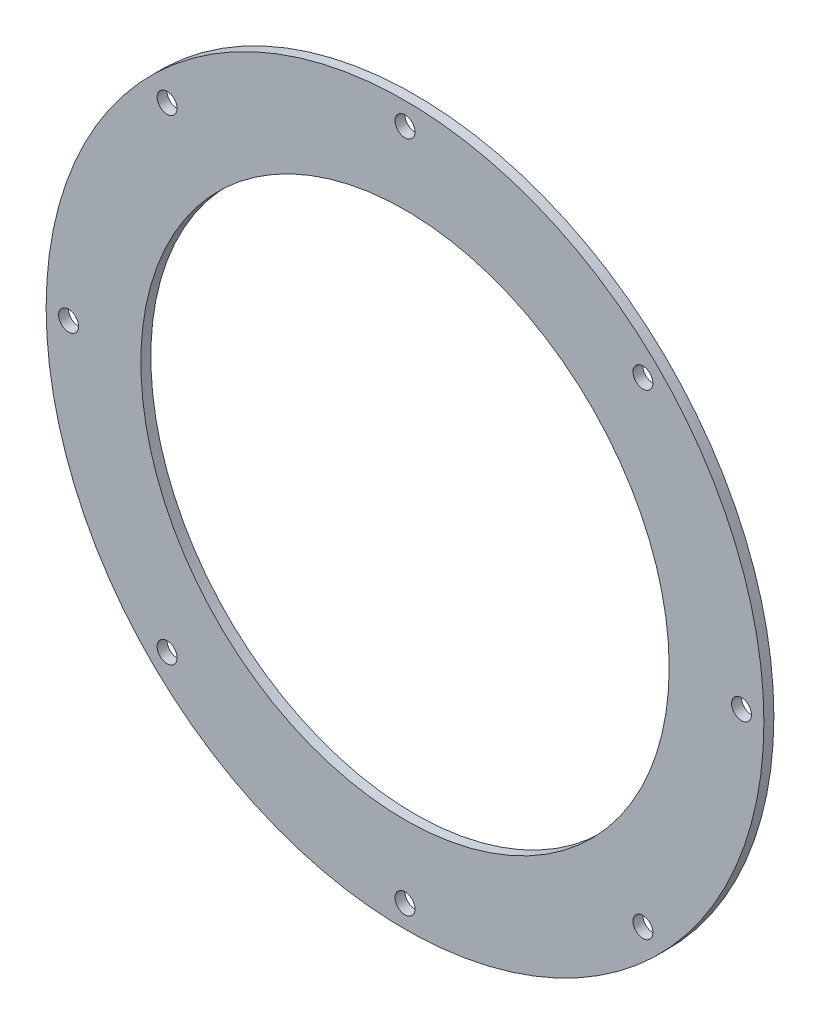
ISO-10303-21;
HEADER;
FILE_DESCRIPTION(('STEP AP214'),'2;1');
FILE_NAME('part.step','',(''),(''),'','','');
FILE_SCHEMA(('AUTOMOTIVE_DESIGN { 1 0 10303 214 1 1 1 1 }'));
ENDSEC;
DATA;
#1=APPLICATION_CONTEXT('core data for automotive mechanical design processes');
#2=APPLICATION_PROTOCOL_DEFINITION('international standard','automotive_design',2000,#1);
#3=PRODUCT_CONTEXT('',#1,'mechanical');
#4=PRODUCT('Part','Part','',(#3));
#5=PRODUCT_RELATED_PRODUCT_CATEGORY('part','',(#4));
#6=PRODUCT_DEFINITION_FORMATION('','',#4);
#7=PRODUCT_DEFINITION_CONTEXT('part definition',#1,'design');
#8=PRODUCT_DEFINITION('design','',#6,#7);
#9=PRODUCT_DEFINITION_SHAPE('','',#8);
#10=(LENGTH_UNIT() NAMED_UNIT(*) SI_UNIT(.MILLI.,.METRE.));
#11=(NAMED_UNIT(*) PLANE_ANGLE_UNIT() SI_UNIT($,.RADIAN.));
#12=(NAMED_UNIT(*) SI_UNIT($,.STERADIAN.) SOLID_ANGLE_UNIT());
#13=UNCERTAINTY_MEASURE_WITH_UNIT(LENGTH_MEASURE(1.E-05),#10,'distance_accuracy_value','');
#14=(GEOMETRIC_REPRESENTATION_CONTEXT(3) GLOBAL_UNCERTAINTY_ASSIGNED_CONTEXT((#13)) GLOBAL_UNIT_ASSIGNED_CONTEXT((#10,
#11,#12)) REPRESENTATION_CONTEXT('',''));
#15=CARTESIAN_POINT('',(0.,0.,0.));
#16=DIRECTION('',(0.,0.,1.));
#17=DIRECTION('',(1.,0.,0.));
#18=AXIS2_PLACEMENT_3D('',#15,#16,#17);
#19=CARTESIAN_POINT('',(0.,0.,2.));
#20=DIRECTION('',(0.,0.,1.));
#21=DIRECTION('',(1.,0.,0.));
#22=AXIS2_PLACEMENT_3D('',#19,#20,#21);
#23=PLANE('',#22);
#24=CARTESIAN_POINT('',(67.5,0.,2.));
#25=DIRECTION('',(0.,0.,1.));
#26=DIRECTION('',(1.,0.,0.));
#27=AXIS2_PLACEMENT_3D('',#24,#25,#26);
#28=CIRCLE('',#27,2.);
#29=CARTESIAN_POINT('',(69.5,0.,2.));
#30=VERTEX_POINT('',#29);
#31=EDGE_CURVE('E104',#30,#30,#28,.T.);
#32=ORIENTED_EDGE('',*,*,#31,.F.);
#33=EDGE_LOOP('',(#32));
#34=FACE_BOUND('',#33,.T.);
#35=CARTESIAN_POINT('',(0.,67.5,2.));
#36=DIRECTION('',(0.,0.,1.));
#37=DIRECTION('',(1.,0.,0.));
#38=AXIS2_PLACEMENT_3D('',#35,#36,#37);
#39=CIRCLE('',#38,2.);
#40=CARTESIAN_POINT('',(2.,67.5,2.));
#41=VERTEX_POINT('',#40);
#42=EDGE_CURVE('E88',#41,#41,#39,.T.);
#43=ORIENTED_EDGE('',*,*,#42,.F.);
#44=EDGE_LOOP('',(#43));
#45=FACE_BOUND('',#44,.T.);
#46=CARTESIAN_POINT('',(-67.5,0.,2.));
#47=DIRECTION('',(0.,0.,1.));
#48=DIRECTION('',(1.,0.,0.));
#49=AXIS2_PLACEMENT_3D('',#46,#47,#48);
#50=CIRCLE('',#49,2.);
#51=CARTESIAN_POINT('',(-65.5,0.,2.));
#52=VERTEX_POINT('',#51);
#53=EDGE_CURVE('E72',#52,#52,#50,.T.);
#54=ORIENTED_EDGE('',*,*,#53,.F.);
#55=EDGE_LOOP('',(#54));
#56=FACE_BOUND('',#55,.T.);
#57=CARTESIAN_POINT('',(0.,0.,2.));
#58=DIRECTION('',(0.,0.,1.));
#59=DIRECTION('',(1.,0.,0.));
#60=AXIS2_PLACEMENT_3D('',#57,#58,#59);
#61=CIRCLE('',#60,53.);
#62=CARTESIAN_POINT('',(53.,0.,2.));
#63=VERTEX_POINT('',#62);
#64=EDGE_CURVE('E56',#63,#63,#61,.T.);
#65=ORIENTED_EDGE('',*,*,#64,.F.);
#66=EDGE_LOOP('',(#65));
#67=FACE_BOUND('',#66,.T.);
#68=CARTESIAN_POINT('',(0.,0.,2.));
#69=DIRECTION('',(0.,0.,1.));
#70=DIRECTION('',(1.,0.,0.));
#71=AXIS2_PLACEMENT_3D('',#68,#69,#70);
#72=CIRCLE('',#71,72.);
#73=CARTESIAN_POINT('',(72.,0.,2.));
#74=VERTEX_POINT('',#73);
#75=EDGE_CURVE('E10',#74,#74,#72,.T.);
#76=ORIENTED_EDGE('',*,*,#75,.T.);
#77=EDGE_LOOP('',(#76));
#78=FACE_BOUND('',#77,.T.);
#79=CARTESIAN_POINT('',(0.,-67.5,2.));
#80=DIRECTION('',(0.,0.,1.));
#81=DIRECTION('',(1.,0.,0.));
#82=AXIS2_PLACEMENT_3D('',#79,#80,#81);
#83=CIRCLE('',#82,2.);
#84=CARTESIAN_POINT('',(2.,-67.5,2.));
#85=VERTEX_POINT('',#84);
#86=EDGE_CURVE('E50',#85,#85,#83,.T.);
#87=ORIENTED_EDGE('',*,*,#86,.F.);
#88=EDGE_LOOP('',(#87));
#89=FACE_BOUND('',#88,.T.);
#90=CARTESIAN_POINT('',(-47.729707730092,-47.729707730092,2.));
#91=DIRECTION('',(0.,0.,1.));
#92=DIRECTION('',(1.,0.,0.));
#93=AXIS2_PLACEMENT_3D('',#90,#91,#92);
#94=CIRCLE('',#93,2.);
#95=CARTESIAN_POINT('',(-45.729707730092,-47.729707730092,2.));
#96=VERTEX_POINT('',#95);
#97=EDGE_CURVE('E64',#96,#96,#94,.T.);
#98=ORIENTED_EDGE('',*,*,#97,.F.);
#99=EDGE_LOOP('',(#98));
#100=FACE_BOUND('',#99,.T.);
#101=CARTESIAN_POINT('',(-47.729707730092,47.729707730092,2.));
#102=DIRECTION('',(0.,0.,1.));
#103=DIRECTION('',(1.,0.,0.));
#104=AXIS2_PLACEMENT_3D('',#101,#102,#103);
#105=CIRCLE('',#104,2.);
#106=CARTESIAN_POINT('',(-45.729707730092,47.729707730092,2.));
#107=VERTEX_POINT('',#106);
#108=EDGE_CURVE('E80',#107,#107,#105,.T.);
#109=ORIENTED_EDGE('',*,*,#108,.F.);
#110=EDGE_LOOP('',(#109));
#111=FACE_BOUND('',#110,.T.);
#112=CARTESIAN_POINT('',(47.729707730092,47.729707730092,2.));
#113=DIRECTION('',(0.,0.,1.));
#114=DIRECTION('',(1.,0.,0.));
#115=AXIS2_PLACEMENT_3D('',#112,#113,#114);
#116=CIRCLE('',#115,2.);
#117=CARTESIAN_POINT('',(49.729707730092,47.729707730092,2.));
#118=VERTEX_POINT('',#117);
#119=EDGE_CURVE('E96',#118,#118,#116,.T.);
#120=ORIENTED_EDGE('',*,*,#119,.F.);
#121=EDGE_LOOP('',(#120));
#122=FACE_BOUND('',#121,.T.);
#123=CARTESIAN_POINT('',(47.729707730092,-47.729707730092,2.));
#124=DIRECTION('',(0.,0.,1.));
#125=DIRECTION('',(1.,0.,0.));
#126=AXIS2_PLACEMENT_3D('',#123,#124,#125);
#127=CIRCLE('',#126,2.);
#128=CARTESIAN_POINT('',(49.729707730092,-47.729707730092,2.));
#129=VERTEX_POINT('',#128);
#130=EDGE_CURVE('E112',#129,#129,#127,.T.);
#131=ORIENTED_EDGE('',*,*,#130,.F.);
#132=EDGE_LOOP('',(#131));
#133=FACE_BOUND('',#132,.T.);
#134=ADVANCED_FACE('F37',(#34,#45,#56,#67,#78,#89,#100,#111,#122,#133),#23,.T.);
#135=CARTESIAN_POINT('',(0.,0.,0.));
#136=DIRECTION('',(0.,0.,1.));
#137=DIRECTION('',(1.,0.,0.));
#138=AXIS2_PLACEMENT_3D('',#135,#136,#137);
#139=PLANE('',#138);
#140=CARTESIAN_POINT('',(0.,0.,0.));
#141=DIRECTION('',(0.,0.,1.));
#142=DIRECTION('',(1.,0.,0.));
#143=AXIS2_PLACEMENT_3D('',#140,#141,#142);
#144=CIRCLE('',#143,72.);
#145=CARTESIAN_POINT('',(72.,0.,0.));
#146=VERTEX_POINT('',#145);
#147=EDGE_CURVE('E41',#146,#146,#144,.T.);
#148=ORIENTED_EDGE('',*,*,#147,.F.);
#149=EDGE_LOOP('',(#148));
#150=FACE_BOUND('',#149,.T.);
#151=CARTESIAN_POINT('',(0.,-67.5,0.));
#152=DIRECTION('',(0.,0.,1.));
#153=DIRECTION('',(1.,0.,0.));
#154=AXIS2_PLACEMENT_3D('',#151,#152,#153);
#155=CIRCLE('',#154,2.);
#156=CARTESIAN_POINT('',(2.,-67.5,0.));
#157=VERTEX_POINT('',#156);
#158=EDGE_CURVE('E52',#157,#157,#155,.T.);
#159=ORIENTED_EDGE('',*,*,#158,.T.);
#160=EDGE_LOOP('',(#159));
#161=FACE_BOUND('',#160,.T.);
#162=CARTESIAN_POINT('',(0.,0.,0.));
#163=DIRECTION('',(0.,0.,1.));
#164=DIRECTION('',(1.,0.,0.));
#165=AXIS2_PLACEMENT_3D('',#162,#163,#164);
#166=CIRCLE('',#165,53.);
#167=CARTESIAN_POINT('',(53.,0.,0.));
#168=VERTEX_POINT('',#167);
#169=EDGE_CURVE('E60',#168,#168,#166,.T.);
#170=ORIENTED_EDGE('',*,*,#169,.T.);
#171=EDGE_LOOP('',(#170));
#172=FACE_BOUND('',#171,.T.);
#173=CARTESIAN_POINT('',(-47.729707730092,-47.729707730092,0.));
#174=DIRECTION('',(0.,0.,1.));
#175=DIRECTION('',(1.,0.,0.));
#176=AXIS2_PLACEMENT_3D('',#173,#174,#175);
#177=CIRCLE('',#176,2.);
#178=CARTESIAN_POINT('',(-45.729707730092,-47.729707730092,0.));
#179=VERTEX_POINT('',#178);
#180=EDGE_CURVE('E68',#179,#179,#177,.T.);
#181=ORIENTED_EDGE('',*,*,#180,.T.);
#182=EDGE_LOOP('',(#181));
#183=FACE_BOUND('',#182,.T.);
#184=CARTESIAN_POINT('',(-67.5,0.,0.));
#185=DIRECTION('',(0.,0.,1.));
#186=DIRECTION('',(1.,0.,0.));
#187=AXIS2_PLACEMENT_3D('',#184,#185,#186);
#188=CIRCLE('',#187,2.);
#189=CARTESIAN_POINT('',(-65.5,0.,0.));
#190=VERTEX_POINT('',#189);
#191=EDGE_CURVE('E76',#190,#190,#188,.T.);
#192=ORIENTED_EDGE('',*,*,#191,.T.);
#193=EDGE_LOOP('',(#192));
#194=FACE_BOUND('',#193,.T.);
#195=CARTESIAN_POINT('',(-47.729707730092,47.729707730092,0.));
#196=DIRECTION('',(0.,0.,1.));
#197=DIRECTION('',(1.,0.,0.));
#198=AXIS2_PLACEMENT_3D('',#195,#196,#197);
#199=CIRCLE('',#198,2.);
#200=CARTESIAN_POINT('',(-45.729707730092,47.729707730092,0.));
#201=VERTEX_POINT('',#200);
#202=EDGE_CURVE('E84',#201,#201,#199,.T.);
#203=ORIENTED_EDGE('',*,*,#202,.T.);
#204=EDGE_LOOP('',(#203));
#205=FACE_BOUND('',#204,.T.);
#206=CARTESIAN_POINT('',(0.,67.5,0.));
#207=DIRECTION('',(0.,0.,1.));
#208=DIRECTION('',(1.,0.,0.));
#209=AXIS2_PLACEMENT_3D('',#206,#207,#208);
#210=CIRCLE('',#209,2.);
#211=CARTESIAN_POINT('',(2.,67.5,0.));
#212=VERTEX_POINT('',#211);
#213=EDGE_CURVE('E92',#212,#212,#210,.T.);
#214=ORIENTED_EDGE('',*,*,#213,.T.);
#215=EDGE_LOOP('',(#214));
#216=FACE_BOUND('',#215,.T.);
#217=CARTESIAN_POINT('',(47.729707730092,47.729707730092,0.));
#218=DIRECTION('',(0.,0.,1.));
#219=DIRECTION('',(1.,0.,0.));
#220=AXIS2_PLACEMENT_3D('',#217,#218,#219);
#221=CIRCLE('',#220,2.);
#222=CARTESIAN_POINT('',(49.729707730092,47.729707730092,0.));
#223=VERTEX_POINT('',#222);
#224=EDGE_CURVE('E100',#223,#223,#221,.T.);
#225=ORIENTED_EDGE('',*,*,#224,.T.);
#226=EDGE_LOOP('',(#225));
#227=FACE_BOUND('',#226,.T.);
#228=CARTESIAN_POINT('',(67.5,0.,0.));
#229=DIRECTION('',(0.,0.,1.));
#230=DIRECTION('',(1.,0.,0.));
#231=AXIS2_PLACEMENT_3D('',#228,#229,#230);
#232=CIRCLE('',#231,2.);
#233=CARTESIAN_POINT('',(69.5,0.,0.));
#234=VERTEX_POINT('',#233);
#235=EDGE_CURVE('E108',#234,#234,#232,.T.);
#236=ORIENTED_EDGE('',*,*,#235,.T.);
#237=EDGE_LOOP('',(#236));
#238=FACE_BOUND('',#237,.T.);
#239=CARTESIAN_POINT('',(47.729707730092,-47.729707730092,0.));
#240=DIRECTION('',(0.,0.,1.));
#241=DIRECTION('',(1.,0.,0.));
#242=AXIS2_PLACEMENT_3D('',#239,#240,#241);
#243=CIRCLE('',#242,2.);
#244=CARTESIAN_POINT('',(49.729707730092,-47.729707730092,0.));
#245=VERTEX_POINT('',#244);
#246=EDGE_CURVE('E116',#245,#245,#243,.T.);
#247=ORIENTED_EDGE('',*,*,#246,.T.);
#248=EDGE_LOOP('',(#247));
#249=FACE_BOUND('',#248,.T.);
#250=ADVANCED_FACE('F128',(#150,#161,#172,#183,#194,#205,#216,#227,#238,#249),#139,.F.);
#251=CARTESIAN_POINT('',(0.,0.,2.));
#252=DIRECTION('',(0.,0.,-1.));
#253=DIRECTION('',(-1.,0.,0.));
#254=AXIS2_PLACEMENT_3D('',#251,#252,#253);
#255=CYLINDRICAL_SURFACE('',#254,72.);
#256=ORIENTED_EDGE('',*,*,#75,.F.);
#257=EDGE_LOOP('',(#256));
#258=FACE_BOUND('',#257,.T.);
#259=ORIENTED_EDGE('',*,*,#147,.T.);
#260=EDGE_LOOP('',(#259));
#261=FACE_BOUND('',#260,.T.);
#262=ADVANCED_FACE('F39',(#258,#261),#255,.T.);
#263=CARTESIAN_POINT('',(0.,-67.5,2.));
#264=DIRECTION('',(0.,0.,-1.));
#265=DIRECTION('',(-1.,0.,0.));
#266=AXIS2_PLACEMENT_3D('',#263,#264,#265);
#267=CYLINDRICAL_SURFACE('',#266,2.);
#268=ORIENTED_EDGE('',*,*,#86,.T.);
#269=EDGE_LOOP('',(#268));
#270=FACE_BOUND('',#269,.T.);
#271=ORIENTED_EDGE('',*,*,#158,.F.);
#272=EDGE_LOOP('',(#271));
#273=FACE_BOUND('',#272,.T.);
#274=ADVANCED_FACE('F138',(#270,#273),#267,.F.);
#275=CARTESIAN_POINT('',(0.,0.,2.));
#276=DIRECTION('',(0.,0.,-1.));
#277=DIRECTION('',(-1.,0.,0.));
#278=AXIS2_PLACEMENT_3D('',#275,#276,#277);
#279=CYLINDRICAL_SURFACE('',#278,53.);
#280=ORIENTED_EDGE('',*,*,#64,.T.);
#281=EDGE_LOOP('',(#280));
#282=FACE_BOUND('',#281,.T.);
#283=ORIENTED_EDGE('',*,*,#169,.F.);
#284=EDGE_LOOP('',(#283));
#285=FACE_BOUND('',#284,.T.);
#286=ADVANCED_FACE('F141',(#282,#285),#279,.F.);
#287=CARTESIAN_POINT('',(-47.729707730092,-47.729707730092,2.));
#288=DIRECTION('',(0.,0.,-1.));
#289=DIRECTION('',(-1.,0.,0.));
#290=AXIS2_PLACEMENT_3D('',#287,#288,#289);
#291=CYLINDRICAL_SURFACE('',#290,2.);
#292=ORIENTED_EDGE('',*,*,#97,.T.);
#293=EDGE_LOOP('',(#292));
#294=FACE_BOUND('',#293,.T.);
#295=ORIENTED_EDGE('',*,*,#180,.F.);
#296=EDGE_LOOP('',(#295));
#297=FACE_BOUND('',#296,.T.);
#298=ADVANCED_FACE('F145',(#294,#297),#291,.F.);
#299=CARTESIAN_POINT('',(-67.5,0.,2.));
#300=DIRECTION('',(0.,0.,-1.));
#301=DIRECTION('',(-1.,0.,0.));
#302=AXIS2_PLACEMENT_3D('',#299,#300,#301);
#303=CYLINDRICAL_SURFACE('',#302,2.);
#304=ORIENTED_EDGE('',*,*,#53,.T.);
#305=EDGE_LOOP('',(#304));
#306=FACE_BOUND('',#305,.T.);
#307=ORIENTED_EDGE('',*,*,#191,.F.);
#308=EDGE_LOOP('',(#307));
#309=FACE_BOUND('',#308,.T.);
#310=ADVANCED_FACE('F149',(#306,#309),#303,.F.);
#311=CARTESIAN_POINT('',(-47.729707730092,47.729707730092,2.));
#312=DIRECTION('',(0.,0.,-1.));
#313=DIRECTION('',(-1.,0.,0.));
#314=AXIS2_PLACEMENT_3D('',#311,#312,#313);
#315=CYLINDRICAL_SURFACE('',#314,2.);
#316=ORIENTED_EDGE('',*,*,#108,.T.);
#317=EDGE_LOOP('',(#316));
#318=FACE_BOUND('',#317,.T.);
#319=ORIENTED_EDGE('',*,*,#202,.F.);
#320=EDGE_LOOP('',(#319));
#321=FACE_BOUND('',#320,.T.);
#322=ADVANCED_FACE('F153',(#318,#321),#315,.F.);
#323=CARTESIAN_POINT('',(0.,67.5,2.));
#324=DIRECTION('',(0.,0.,-1.));
#325=DIRECTION('',(-1.,0.,0.));
#326=AXIS2_PLACEMENT_3D('',#323,#324,#325);
#327=CYLINDRICAL_SURFACE('',#326,2.);
#328=ORIENTED_EDGE('',*,*,#42,.T.);
#329=EDGE_LOOP('',(#328));
#330=FACE_BOUND('',#329,.T.);
#331=ORIENTED_EDGE('',*,*,#213,.F.);
#332=EDGE_LOOP('',(#331));
#333=FACE_BOUND('',#332,.T.);
#334=ADVANCED_FACE('F157',(#330,#333),#327,.F.);
#335=CARTESIAN_POINT('',(47.729707730092,47.729707730092,2.));
#336=DIRECTION('',(0.,0.,-1.));
#337=DIRECTION('',(-1.,0.,0.));
#338=AXIS2_PLACEMENT_3D('',#335,#336,#337);
#339=CYLINDRICAL_SURFACE('',#338,2.);
#340=ORIENTED_EDGE('',*,*,#119,.T.);
#341=EDGE_LOOP('',(#340));
#342=FACE_BOUND('',#341,.T.);
#343=ORIENTED_EDGE('',*,*,#224,.F.);
#344=EDGE_LOOP('',(#343));
#345=FACE_BOUND('',#344,.T.);
#346=ADVANCED_FACE('F161',(#342,#345),#339,.F.);
#347=CARTESIAN_POINT('',(67.5,0.,2.));
#348=DIRECTION('',(0.,0.,-1.));
#349=DIRECTION('',(-1.,0.,0.));
#350=AXIS2_PLACEMENT_3D('',#347,#348,#349);
#351=CYLINDRICAL_SURFACE('',#350,2.);
#352=ORIENTED_EDGE('',*,*,#31,.T.);
#353=EDGE_LOOP('',(#352));
#354=FACE_BOUND('',#353,.T.);
#355=ORIENTED_EDGE('',*,*,#235,.F.);
#356=EDGE_LOOP('',(#355));
#357=FACE_BOUND('',#356,.T.);
#358=ADVANCED_FACE('F165',(#354,#357),#351,.F.);
#359=CARTESIAN_POINT('',(47.729707730092,-47.729707730092,2.));
#360=DIRECTION('',(0.,0.,-1.));
#361=DIRECTION('',(-1.,0.,0.));
#362=AXIS2_PLACEMENT_3D('',#359,#360,#361);
#363=CYLINDRICAL_SURFACE('',#362,2.);
#364=ORIENTED_EDGE('',*,*,#130,.T.);
#365=EDGE_LOOP('',(#364));
#366=FACE_BOUND('',#365,.T.);
#367=ORIENTED_EDGE('',*,*,#246,.F.);
#368=EDGE_LOOP('',(#367));
#369=FACE_BOUND('',#368,.T.);
#370=ADVANCED_FACE('F124',(#366,#369),#363,.F.);
#371=CLOSED_SHELL('',(#134,#250,#262,#274,#286,#298,#310,#322,#334,#346,#358,#370));
#372=MANIFOLD_SOLID_BREP('B2',#371);
#373=ADVANCED_BREP_SHAPE_REPRESENTATION('',(#18,#372),#14);
#374=SHAPE_DEFINITION_REPRESENTATION(#9,#373);
ENDSEC;
END-ISO-10303-21;
